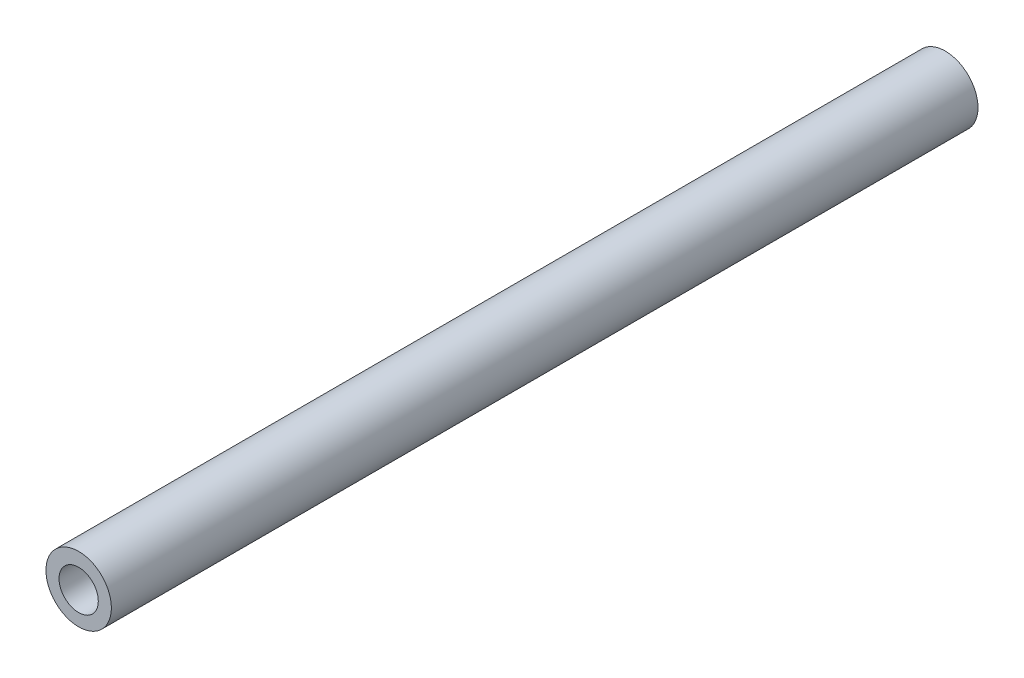
ISO-10303-21;
HEADER;
FILE_DESCRIPTION(('STEP AP214'),'2;1');
FILE_NAME('part.step','',(''),(''),'','','');
FILE_SCHEMA(('AUTOMOTIVE_DESIGN { 1 0 10303 214 1 1 1 1 }'));
ENDSEC;
DATA;
#1=APPLICATION_CONTEXT('core data for automotive mechanical design processes');
#2=APPLICATION_PROTOCOL_DEFINITION('international standard','automotive_design',2000,#1);
#3=PRODUCT_CONTEXT('',#1,'mechanical');
#4=PRODUCT('Part','Part','',(#3));
#5=PRODUCT_RELATED_PRODUCT_CATEGORY('part','',(#4));
#6=PRODUCT_DEFINITION_FORMATION('','',#4);
#7=PRODUCT_DEFINITION_CONTEXT('part definition',#1,'design');
#8=PRODUCT_DEFINITION('design','',#6,#7);
#9=PRODUCT_DEFINITION_SHAPE('','',#8);
#10=(LENGTH_UNIT() NAMED_UNIT(*) SI_UNIT(.MILLI.,.METRE.));
#11=(NAMED_UNIT(*) PLANE_ANGLE_UNIT() SI_UNIT($,.RADIAN.));
#12=(NAMED_UNIT(*) SI_UNIT($,.STERADIAN.) SOLID_ANGLE_UNIT());
#13=UNCERTAINTY_MEASURE_WITH_UNIT(LENGTH_MEASURE(1.E-05),#10,'distance_accuracy_value','');
#14=(GEOMETRIC_REPRESENTATION_CONTEXT(3) GLOBAL_UNCERTAINTY_ASSIGNED_CONTEXT((#13)) GLOBAL_UNIT_ASSIGNED_CONTEXT((#10,
#11,#12)) REPRESENTATION_CONTEXT('',''));
#15=CARTESIAN_POINT('',(0.,0.,0.));
#16=DIRECTION('',(0.,0.,1.));
#17=DIRECTION('',(1.,0.,0.));
#18=AXIS2_PLACEMENT_3D('',#15,#16,#17);
#19=CARTESIAN_POINT('',(0.0522885789394772,0.183010026288174,132.4));
#20=DIRECTION('',(0.,0.,1.));
#21=DIRECTION('',(1.,0.,0.));
#22=AXIS2_PLACEMENT_3D('',#19,#20,#21);
#23=PLANE('',#22);
#24=CARTESIAN_POINT('',(0.0522885789394772,0.183010026288174,132.4));
#25=DIRECTION('',(0.,0.,1.));
#26=DIRECTION('',(1.,0.,0.));
#27=AXIS2_PLACEMENT_3D('',#24,#25,#26);
#28=CIRCLE('',#27,5.);
#29=CARTESIAN_POINT('',(5.05228857893948,0.183010026288174,132.4));
#30=VERTEX_POINT('',#29);
#31=EDGE_CURVE('E10',#30,#30,#28,.T.);
#32=ORIENTED_EDGE('',*,*,#31,.T.);
#33=EDGE_LOOP('',(#32));
#34=FACE_BOUND('',#33,.T.);
#35=CARTESIAN_POINT('',(0.0522885789394731,0.0784328684092173,132.4));
#36=DIRECTION('',(0.,0.,1.));
#37=DIRECTION('',(1.,0.,0.));
#38=AXIS2_PLACEMENT_3D('',#35,#36,#37);
#39=CIRCLE('',#38,3.);
#40=CARTESIAN_POINT('',(3.05228857893947,0.0784328684092173,132.4));
#41=VERTEX_POINT('',#40);
#42=EDGE_CURVE('E50',#41,#41,#39,.T.);
#43=ORIENTED_EDGE('',*,*,#42,.F.);
#44=EDGE_LOOP('',(#43));
#45=FACE_BOUND('',#44,.T.);
#46=ADVANCED_FACE('F37',(#34,#45),#23,.T.);
#47=CARTESIAN_POINT('',(0.0522885789394772,0.183010026288174,0.));
#48=DIRECTION('',(0.,0.,1.));
#49=DIRECTION('',(1.,0.,0.));
#50=AXIS2_PLACEMENT_3D('',#47,#48,#49);
#51=PLANE('',#50);
#52=CARTESIAN_POINT('',(0.0522885789394772,0.183010026288174,0.));
#53=DIRECTION('',(0.,0.,1.));
#54=DIRECTION('',(1.,0.,0.));
#55=AXIS2_PLACEMENT_3D('',#52,#53,#54);
#56=CIRCLE('',#55,5.);
#57=CARTESIAN_POINT('',(5.05228857893948,0.183010026288174,0.));
#58=VERTEX_POINT('',#57);
#59=EDGE_CURVE('E41',#58,#58,#56,.T.);
#60=ORIENTED_EDGE('',*,*,#59,.F.);
#61=EDGE_LOOP('',(#60));
#62=FACE_BOUND('',#61,.T.);
#63=CARTESIAN_POINT('',(0.0522885789394731,0.0784328684092173,0.));
#64=DIRECTION('',(0.,0.,1.));
#65=DIRECTION('',(1.,0.,0.));
#66=AXIS2_PLACEMENT_3D('',#63,#64,#65);
#67=CIRCLE('',#66,3.);
#68=CARTESIAN_POINT('',(3.05228857893947,0.0784328684092173,0.));
#69=VERTEX_POINT('',#68);
#70=EDGE_CURVE('E52',#69,#69,#67,.T.);
#71=ORIENTED_EDGE('',*,*,#70,.T.);
#72=EDGE_LOOP('',(#71));
#73=FACE_BOUND('',#72,.T.);
#74=ADVANCED_FACE('F64',(#62,#73),#51,.F.);
#75=CARTESIAN_POINT('',(0.0522885789394772,0.183010026288174,132.4));
#76=DIRECTION('',(0.,0.,-1.));
#77=DIRECTION('',(-1.,0.,0.));
#78=AXIS2_PLACEMENT_3D('',#75,#76,#77);
#79=CYLINDRICAL_SURFACE('',#78,5.);
#80=ORIENTED_EDGE('',*,*,#31,.F.);
#81=EDGE_LOOP('',(#80));
#82=FACE_BOUND('',#81,.T.);
#83=ORIENTED_EDGE('',*,*,#59,.T.);
#84=EDGE_LOOP('',(#83));
#85=FACE_BOUND('',#84,.T.);
#86=ADVANCED_FACE('F39',(#82,#85),#79,.T.);
#87=CARTESIAN_POINT('',(0.0522885789394731,0.0784328684092173,132.4));
#88=DIRECTION('',(0.,0.,-1.));
#89=DIRECTION('',(-1.,0.,0.));
#90=AXIS2_PLACEMENT_3D('',#87,#88,#89);
#91=CYLINDRICAL_SURFACE('',#90,3.);
#92=ORIENTED_EDGE('',*,*,#42,.T.);
#93=EDGE_LOOP('',(#92));
#94=FACE_BOUND('',#93,.T.);
#95=ORIENTED_EDGE('',*,*,#70,.F.);
#96=EDGE_LOOP('',(#95));
#97=FACE_BOUND('',#96,.T.);
#98=ADVANCED_FACE('F60',(#94,#97),#91,.F.);
#99=CLOSED_SHELL('',(#46,#74,#86,#98));
#100=MANIFOLD_SOLID_BREP('B2',#99);
#101=ADVANCED_BREP_SHAPE_REPRESENTATION('',(#18,#100),#14);
#102=SHAPE_DEFINITION_REPRESENTATION(#9,#101);
ENDSEC;
END-ISO-10303-21;
